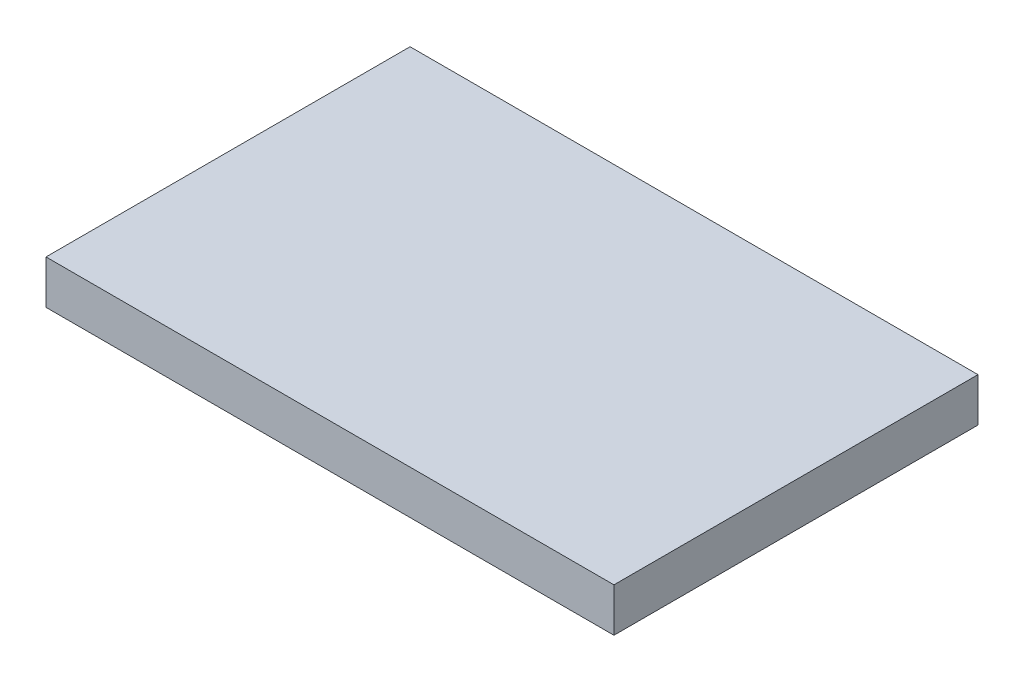
ISO-10303-21;
HEADER;
FILE_DESCRIPTION(('STEP AP214'),'2;1');
FILE_NAME('part.step','',(''),(''),'','','');
FILE_SCHEMA(('AUTOMOTIVE_DESIGN { 1 0 10303 214 1 1 1 1 }'));
ENDSEC;
DATA;
#1=APPLICATION_CONTEXT('core data for automotive mechanical design processes');
#2=APPLICATION_PROTOCOL_DEFINITION('international standard','automotive_design',2000,#1);
#3=PRODUCT_CONTEXT('',#1,'mechanical');
#4=PRODUCT('Part','Part','',(#3));
#5=PRODUCT_RELATED_PRODUCT_CATEGORY('part','',(#4));
#6=PRODUCT_DEFINITION_FORMATION('','',#4);
#7=PRODUCT_DEFINITION_CONTEXT('part definition',#1,'design');
#8=PRODUCT_DEFINITION('design','',#6,#7);
#9=PRODUCT_DEFINITION_SHAPE('','',#8);
#10=(LENGTH_UNIT() NAMED_UNIT(*) SI_UNIT(.MILLI.,.METRE.));
#11=(NAMED_UNIT(*) PLANE_ANGLE_UNIT() SI_UNIT($,.RADIAN.));
#12=(NAMED_UNIT(*) SI_UNIT($,.STERADIAN.) SOLID_ANGLE_UNIT());
#13=UNCERTAINTY_MEASURE_WITH_UNIT(LENGTH_MEASURE(1.E-05),#10,'distance_accuracy_value','');
#14=(GEOMETRIC_REPRESENTATION_CONTEXT(3) GLOBAL_UNCERTAINTY_ASSIGNED_CONTEXT((#13)) GLOBAL_UNIT_ASSIGNED_CONTEXT((#10,
#11,#12)) REPRESENTATION_CONTEXT('',''));
#15=CARTESIAN_POINT('',(0.,0.,0.));
#16=DIRECTION('',(0.,0.,1.));
#17=DIRECTION('',(1.,0.,0.));
#18=AXIS2_PLACEMENT_3D('',#15,#16,#17);
#19=CARTESIAN_POINT('',(195.,30.,-125.));
#20=DIRECTION('',(-1.,0.,0.));
#21=DIRECTION('',(0.,0.,1.));
#22=AXIS2_PLACEMENT_3D('',#19,#20,#21);
#23=PLANE('',#22);
#24=DIRECTION('',(0.,0.,-1.));
#25=VECTOR('',#24,1.);
#26=CARTESIAN_POINT('',(195.,0.,-125.));
#27=LINE('',#26,#25);
#28=CARTESIAN_POINT('',(195.,0.,125.));
#29=VERTEX_POINT('',#28);
#30=CARTESIAN_POINT('',(195.,0.,-125.));
#31=VERTEX_POINT('',#30);
#32=EDGE_CURVE('E106',#29,#31,#27,.T.);
#33=ORIENTED_EDGE('',*,*,#32,.T.);
#34=DIRECTION('',(0.,-1.,0.));
#35=VECTOR('',#34,1.);
#36=CARTESIAN_POINT('',(195.,30.,-125.));
#37=LINE('',#36,#35);
#38=CARTESIAN_POINT('',(195.,30.,-125.));
#39=VERTEX_POINT('',#38);
#40=EDGE_CURVE('E11',#39,#31,#37,.T.);
#41=ORIENTED_EDGE('',*,*,#40,.F.);
#42=DIRECTION('',(0.,0.,-1.));
#43=VECTOR('',#42,1.);
#44=CARTESIAN_POINT('',(195.,30.,-125.));
#45=LINE('',#44,#43);
#46=CARTESIAN_POINT('',(195.,30.,125.));
#47=VERTEX_POINT('',#46);
#48=EDGE_CURVE('E94',#47,#39,#45,.T.);
#49=ORIENTED_EDGE('',*,*,#48,.F.);
#50=DIRECTION('',(0.,-1.,0.));
#51=VECTOR('',#50,1.);
#52=CARTESIAN_POINT('',(195.,30.,125.));
#53=LINE('',#52,#51);
#54=EDGE_CURVE('E102',#47,#29,#53,.T.);
#55=ORIENTED_EDGE('',*,*,#54,.T.);
#56=EDGE_LOOP('',(#33,#41,#49,#55));
#57=FACE_BOUND('',#56,.T.);
#58=ADVANCED_FACE('F43',(#57),#23,.F.);
#59=CARTESIAN_POINT('',(-195.,30.,-125.));
#60=DIRECTION('',(0.,0.,1.));
#61=DIRECTION('',(1.,0.,0.));
#62=AXIS2_PLACEMENT_3D('',#59,#60,#61);
#63=PLANE('',#62);
#64=DIRECTION('',(-1.,0.,0.));
#65=VECTOR('',#64,1.);
#66=CARTESIAN_POINT('',(-195.,0.,-125.));
#67=LINE('',#66,#65);
#68=CARTESIAN_POINT('',(-195.,0.,-125.));
#69=VERTEX_POINT('',#68);
#70=EDGE_CURVE('E98',#31,#69,#67,.T.);
#71=ORIENTED_EDGE('',*,*,#70,.T.);
#72=DIRECTION('',(0.,-1.,0.));
#73=VECTOR('',#72,1.);
#74=CARTESIAN_POINT('',(-195.,30.,-125.));
#75=LINE('',#74,#73);
#76=CARTESIAN_POINT('',(-195.,30.,-125.));
#77=VERTEX_POINT('',#76);
#78=EDGE_CURVE('E51',#77,#69,#75,.T.);
#79=ORIENTED_EDGE('',*,*,#78,.F.);
#80=DIRECTION('',(-1.,0.,0.));
#81=VECTOR('',#80,1.);
#82=CARTESIAN_POINT('',(-195.,30.,-125.));
#83=LINE('',#82,#81);
#84=EDGE_CURVE('E89',#39,#77,#83,.T.);
#85=ORIENTED_EDGE('',*,*,#84,.F.);
#86=ORIENTED_EDGE('',*,*,#40,.T.);
#87=EDGE_LOOP('',(#71,#79,#85,#86));
#88=FACE_BOUND('',#87,.T.);
#89=ADVANCED_FACE('F97',(#88),#63,.F.);
#90=CARTESIAN_POINT('',(-195.,30.,-125.));
#91=DIRECTION('',(1.,0.,0.));
#92=DIRECTION('',(0.,0.,-1.));
#93=AXIS2_PLACEMENT_3D('',#90,#91,#92);
#94=PLANE('',#93);
#95=DIRECTION('',(0.,0.,1.));
#96=VECTOR('',#95,1.);
#97=CARTESIAN_POINT('',(-195.,0.,-125.));
#98=LINE('',#97,#96);
#99=CARTESIAN_POINT('',(-195.,0.,125.));
#100=VERTEX_POINT('',#99);
#101=EDGE_CURVE('E76',#69,#100,#98,.T.);
#102=ORIENTED_EDGE('',*,*,#101,.T.);
#103=DIRECTION('',(0.,-1.,0.));
#104=VECTOR('',#103,1.);
#105=CARTESIAN_POINT('',(-195.,30.,125.));
#106=LINE('',#105,#104);
#107=CARTESIAN_POINT('',(-195.,30.,125.));
#108=VERTEX_POINT('',#107);
#109=EDGE_CURVE('E99',#108,#100,#106,.T.);
#110=ORIENTED_EDGE('',*,*,#109,.F.);
#111=DIRECTION('',(0.,0.,1.));
#112=VECTOR('',#111,1.);
#113=CARTESIAN_POINT('',(-195.,30.,-125.));
#114=LINE('',#113,#112);
#115=EDGE_CURVE('E92',#77,#108,#114,.T.);
#116=ORIENTED_EDGE('',*,*,#115,.F.);
#117=ORIENTED_EDGE('',*,*,#78,.T.);
#118=EDGE_LOOP('',(#102,#110,#116,#117));
#119=FACE_BOUND('',#118,.T.);
#120=ADVANCED_FACE('F100',(#119),#94,.F.);
#121=CARTESIAN_POINT('',(-195.,30.,125.));
#122=DIRECTION('',(0.,0.,-1.));
#123=DIRECTION('',(-1.,0.,0.));
#124=AXIS2_PLACEMENT_3D('',#121,#122,#123);
#125=PLANE('',#124);
#126=DIRECTION('',(1.,0.,0.));
#127=VECTOR('',#126,1.);
#128=CARTESIAN_POINT('',(-195.,0.,125.));
#129=LINE('',#128,#127);
#130=EDGE_CURVE('E82',#100,#29,#129,.T.);
#131=ORIENTED_EDGE('',*,*,#130,.T.);
#132=ORIENTED_EDGE('',*,*,#54,.F.);
#133=DIRECTION('',(1.,0.,0.));
#134=VECTOR('',#133,1.);
#135=CARTESIAN_POINT('',(-195.,30.,125.));
#136=LINE('',#135,#134);
#137=EDGE_CURVE('E59',#108,#47,#136,.T.);
#138=ORIENTED_EDGE('',*,*,#137,.F.);
#139=ORIENTED_EDGE('',*,*,#109,.T.);
#140=EDGE_LOOP('',(#131,#132,#138,#139));
#141=FACE_BOUND('',#140,.T.);
#142=ADVANCED_FACE('F113',(#141),#125,.F.);
#143=CARTESIAN_POINT('',(0.,30.,0.));
#144=DIRECTION('',(0.,1.,0.));
#145=DIRECTION('',(0.,0.,1.));
#146=AXIS2_PLACEMENT_3D('',#143,#144,#145);
#147=PLANE('',#146);
#148=ORIENTED_EDGE('',*,*,#48,.T.);
#149=ORIENTED_EDGE('',*,*,#84,.T.);
#150=ORIENTED_EDGE('',*,*,#115,.T.);
#151=ORIENTED_EDGE('',*,*,#137,.T.);
#152=EDGE_LOOP('',(#148,#149,#150,#151));
#153=FACE_BOUND('',#152,.T.);
#154=ADVANCED_FACE('F90',(#153),#147,.T.);
#155=CARTESIAN_POINT('',(0.,0.,0.));
#156=DIRECTION('',(0.,1.,0.));
#157=DIRECTION('',(0.,0.,1.));
#158=AXIS2_PLACEMENT_3D('',#155,#156,#157);
#159=PLANE('',#158);
#160=ORIENTED_EDGE('',*,*,#32,.F.);
#161=ORIENTED_EDGE('',*,*,#130,.F.);
#162=ORIENTED_EDGE('',*,*,#101,.F.);
#163=ORIENTED_EDGE('',*,*,#70,.F.);
#164=EDGE_LOOP('',(#160,#161,#162,#163));
#165=FACE_BOUND('',#164,.T.);
#166=ADVANCED_FACE('F116',(#165),#159,.F.);
#167=CLOSED_SHELL('',(#58,#89,#120,#142,#154,#166));
#168=MANIFOLD_SOLID_BREP('B2',#167);
#169=ADVANCED_BREP_SHAPE_REPRESENTATION('',(#18,#168),#14);
#170=SHAPE_DEFINITION_REPRESENTATION(#9,#169);
ENDSEC;
END-ISO-10303-21;
